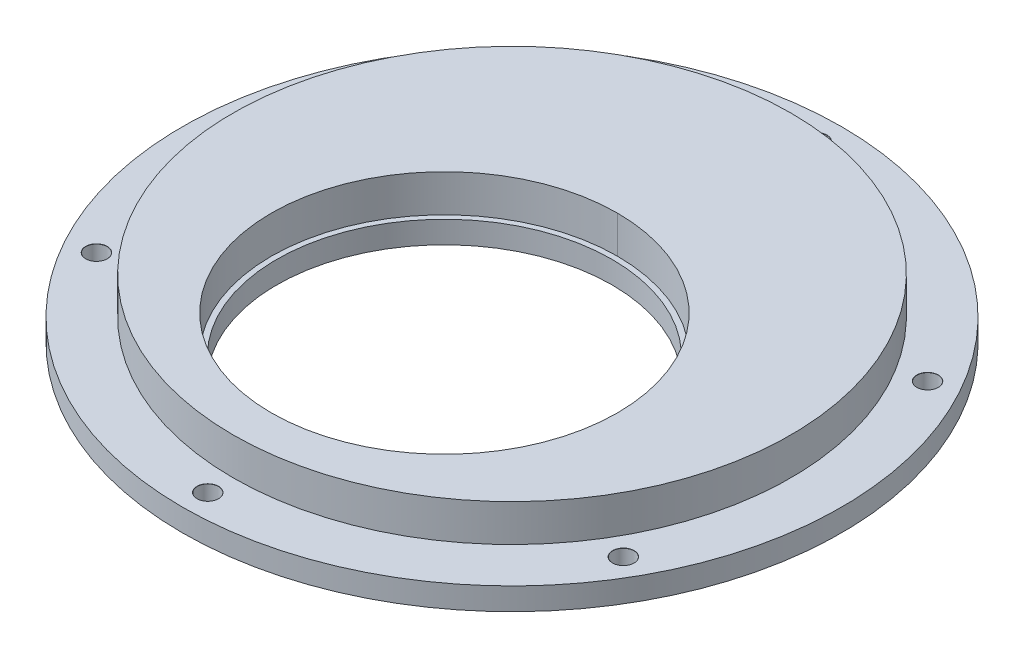
ISO-10303-21;
HEADER;
FILE_DESCRIPTION(('STEP AP214'),'2;1');
FILE_NAME('part.step','',(''),(''),'','','');
FILE_SCHEMA(('AUTOMOTIVE_DESIGN { 1 0 10303 214 1 1 1 1 }'));
ENDSEC;
DATA;
#1=APPLICATION_CONTEXT('core data for automotive mechanical design processes');
#2=APPLICATION_PROTOCOL_DEFINITION('international standard','automotive_design',2000,#1);
#3=PRODUCT_CONTEXT('',#1,'mechanical');
#4=PRODUCT('Part','Part','',(#3));
#5=PRODUCT_RELATED_PRODUCT_CATEGORY('part','',(#4));
#6=PRODUCT_DEFINITION_FORMATION('','',#4);
#7=PRODUCT_DEFINITION_CONTEXT('part definition',#1,'design');
#8=PRODUCT_DEFINITION('design','',#6,#7);
#9=PRODUCT_DEFINITION_SHAPE('','',#8);
#10=(LENGTH_UNIT() NAMED_UNIT(*) SI_UNIT(.MILLI.,.METRE.));
#11=(NAMED_UNIT(*) PLANE_ANGLE_UNIT() SI_UNIT($,.RADIAN.));
#12=(NAMED_UNIT(*) SI_UNIT($,.STERADIAN.) SOLID_ANGLE_UNIT());
#13=UNCERTAINTY_MEASURE_WITH_UNIT(LENGTH_MEASURE(1.E-05),#10,'distance_accuracy_value','');
#14=(GEOMETRIC_REPRESENTATION_CONTEXT(3) GLOBAL_UNCERTAINTY_ASSIGNED_CONTEXT((#13)) GLOBAL_UNIT_ASSIGNED_CONTEXT((#10,
#11,#12)) REPRESENTATION_CONTEXT('',''));
#15=CARTESIAN_POINT('',(0.,0.,0.));
#16=DIRECTION('',(0.,0.,1.));
#17=DIRECTION('',(1.,0.,0.));
#18=AXIS2_PLACEMENT_3D('',#15,#16,#17);
#19=CARTESIAN_POINT('',(0.,4.160000062,12.7));
#20=DIRECTION('',(0.,-1.,0.));
#21=DIRECTION('',(0.,0.,-1.));
#22=AXIS2_PLACEMENT_3D('',#19,#20,#21);
#23=CYLINDRICAL_SURFACE('',#22,32.512);
#24=CARTESIAN_POINT('',(0.,4.160000062,12.7));
#25=DIRECTION('',(0.,-1.,0.));
#26=DIRECTION('',(0.,0.,-1.));
#27=AXIS2_PLACEMENT_3D('',#24,#25,#26);
#28=CIRCLE('',#27,32.512);
#29=CARTESIAN_POINT('',(0.,4.160000062,-19.812));
#30=VERTEX_POINT('',#29);
#31=EDGE_CURVE('E11',#30,#30,#28,.T.);
#32=ORIENTED_EDGE('',*,*,#31,.T.);
#33=EDGE_LOOP('',(#32));
#34=FACE_BOUND('',#33,.T.);
#35=CARTESIAN_POINT('',(0.,0.,12.7));
#36=DIRECTION('',(0.,-1.,0.));
#37=DIRECTION('',(0.,0.,-1.));
#38=AXIS2_PLACEMENT_3D('',#35,#36,#37);
#39=CIRCLE('',#38,32.512);
#40=CARTESIAN_POINT('',(0.,0.,-19.812));
#41=VERTEX_POINT('',#40);
#42=EDGE_CURVE('E54',#41,#41,#39,.T.);
#43=ORIENTED_EDGE('',*,*,#42,.F.);
#44=EDGE_LOOP('',(#43));
#45=FACE_BOUND('',#44,.T.);
#46=ADVANCED_FACE('F51',(#34,#45),#23,.T.);
#47=CARTESIAN_POINT('',(0.,4.160000062,12.7));
#48=DIRECTION('',(0.,-1.,0.));
#49=DIRECTION('',(0.,0.,-1.));
#50=AXIS2_PLACEMENT_3D('',#47,#48,#49);
#51=PLANE('',#50);
#52=CARTESIAN_POINT('',(0.,4.160000062,12.7));
#53=DIRECTION('',(0.,-1.,0.));
#54=DIRECTION('',(0.,0.,-1.));
#55=AXIS2_PLACEMENT_3D('',#52,#53,#54);
#56=CIRCLE('',#55,31.496);
#57=CARTESIAN_POINT('',(0.,4.160000062,-18.796));
#58=VERTEX_POINT('',#57);
#59=EDGE_CURVE('E61',#58,#58,#56,.T.);
#60=ORIENTED_EDGE('',*,*,#59,.T.);
#61=EDGE_LOOP('',(#60));
#62=FACE_BOUND('',#61,.T.);
#63=ORIENTED_EDGE('',*,*,#31,.F.);
#64=EDGE_LOOP('',(#63));
#65=FACE_BOUND('',#64,.T.);
#66=ADVANCED_FACE('F69',(#62,#65),#51,.F.);
#67=CARTESIAN_POINT('',(0.,0.,12.7));
#68=DIRECTION('',(0.,-1.,0.));
#69=DIRECTION('',(0.,0.,-1.));
#70=AXIS2_PLACEMENT_3D('',#67,#68,#69);
#71=PLANE('',#70);
#72=CARTESIAN_POINT('',(0.,0.,12.7));
#73=DIRECTION('',(0.,-1.,0.));
#74=DIRECTION('',(0.,0.,-1.));
#75=AXIS2_PLACEMENT_3D('',#72,#73,#74);
#76=CIRCLE('',#75,31.496);
#77=CARTESIAN_POINT('',(0.,0.,-18.796));
#78=VERTEX_POINT('',#77);
#79=EDGE_CURVE('E63',#78,#78,#76,.T.);
#80=ORIENTED_EDGE('',*,*,#79,.F.);
#81=EDGE_LOOP('',(#80));
#82=FACE_BOUND('',#81,.T.);
#83=ORIENTED_EDGE('',*,*,#42,.T.);
#84=EDGE_LOOP('',(#83));
#85=FACE_BOUND('',#84,.T.);
#86=ADVANCED_FACE('F75',(#82,#85),#71,.T.);
#87=CARTESIAN_POINT('',(0.,4.160000062,12.7));
#88=DIRECTION('',(0.,-1.,0.));
#89=DIRECTION('',(0.,0.,-1.));
#90=AXIS2_PLACEMENT_3D('',#87,#88,#89);
#91=CYLINDRICAL_SURFACE('',#90,31.496);
#92=ORIENTED_EDGE('',*,*,#59,.F.);
#93=EDGE_LOOP('',(#92));
#94=FACE_BOUND('',#93,.T.);
#95=ORIENTED_EDGE('',*,*,#79,.T.);
#96=EDGE_LOOP('',(#95));
#97=FACE_BOUND('',#96,.T.);
#98=ADVANCED_FACE('F72',(#94,#97),#91,.F.);
#99=CLOSED_SHELL('',(#46,#66,#86,#98));
#100=MANIFOLD_SOLID_BREP('B2',#99);
#101=CARTESIAN_POINT('',(-49.4933518262803,4.191,-28.5750000000006));
#102=DIRECTION('',(0.,1.,0.));
#103=DIRECTION('',(0.,0.,1.));
#104=AXIS2_PLACEMENT_3D('',#101,#102,#103);
#105=CYLINDRICAL_SURFACE('',#104,2.);
#106=CARTESIAN_POINT('',(-49.4933518262803,0.,-28.5750000000006));
#107=DIRECTION('',(0.,1.,0.));
#108=DIRECTION('',(0.,0.,1.));
#109=AXIS2_PLACEMENT_3D('',#106,#107,#108);
#110=CIRCLE('',#109,2.);
#111=CARTESIAN_POINT('',(-49.4933518262803,0.,-30.5750000000006));
#112=VERTEX_POINT('',#111);
#113=CARTESIAN_POINT('',(-49.4933518262803,0.,-26.5750000000006));
#114=VERTEX_POINT('',#113);
#115=EDGE_CURVE('E215',#112,#114,#110,.T.);
#116=ORIENTED_EDGE('',*,*,#115,.F.);
#117=DIRECTION('',(0.,1.,0.));
#118=VECTOR('',#117,1.);
#119=CARTESIAN_POINT('',(-49.4933518262803,4.191,-30.5750000000006));
#120=LINE('',#119,#118);
#121=CARTESIAN_POINT('',(-49.4933518262803,4.166,-30.5750000000006));
#122=VERTEX_POINT('',#121);
#123=EDGE_CURVE('E49',#112,#122,#120,.T.);
#124=ORIENTED_EDGE('',*,*,#123,.T.);
#125=CARTESIAN_POINT('',(-49.4933518262803,4.166,-28.5750000000006));
#126=DIRECTION('',(0.,1.,0.));
#127=DIRECTION('',(0.,0.,1.));
#128=AXIS2_PLACEMENT_3D('',#125,#126,#127);
#129=CIRCLE('',#128,2.);
#130=CARTESIAN_POINT('',(-49.4933518262803,4.166,-26.5750000000006));
#131=VERTEX_POINT('',#130);
#132=EDGE_CURVE('E217',#122,#131,#129,.T.);
#133=ORIENTED_EDGE('',*,*,#132,.T.);
#134=DIRECTION('',(0.,-1.,0.));
#135=VECTOR('',#134,1.);
#136=CARTESIAN_POINT('',(-49.4933518262803,4.191,-26.5750000000006));
#137=LINE('',#136,#135);
#138=EDGE_CURVE('E122',#131,#114,#137,.T.);
#139=ORIENTED_EDGE('',*,*,#138,.T.);
#140=EDGE_LOOP('',(#116,#124,#133,#139));
#141=FACE_BOUND('',#140,.T.);
#142=ADVANCED_FACE('F113',(#141),#105,.F.);
#143=CARTESIAN_POINT('',(0.,4.191,-57.15));
#144=DIRECTION('',(0.,1.,0.));
#145=DIRECTION('',(0.,0.,1.));
#146=AXIS2_PLACEMENT_3D('',#143,#144,#145);
#147=CYLINDRICAL_SURFACE('',#146,2.);
#148=CARTESIAN_POINT('',(0.,0.,-57.15));
#149=DIRECTION('',(0.,1.,0.));
#150=DIRECTION('',(0.,0.,1.));
#151=AXIS2_PLACEMENT_3D('',#148,#149,#150);
#152=CIRCLE('',#151,2.);
#153=CARTESIAN_POINT('',(0.,0.,-59.15));
#154=VERTEX_POINT('',#153);
#155=CARTESIAN_POINT('',(0.,0.,-55.15));
#156=VERTEX_POINT('',#155);
#157=EDGE_CURVE('E268',#154,#156,#152,.T.);
#158=ORIENTED_EDGE('',*,*,#157,.F.);
#159=DIRECTION('',(0.,1.,0.));
#160=VECTOR('',#159,1.);
#161=CARTESIAN_POINT('',(0.,4.191,-59.15));
#162=LINE('',#161,#160);
#163=CARTESIAN_POINT('',(0.,4.166,-59.15));
#164=VERTEX_POINT('',#163);
#165=EDGE_CURVE('E208',#154,#164,#162,.T.);
#166=ORIENTED_EDGE('',*,*,#165,.T.);
#167=CARTESIAN_POINT('',(0.,4.166,-57.15));
#168=DIRECTION('',(0.,1.,0.));
#169=DIRECTION('',(0.,0.,1.));
#170=AXIS2_PLACEMENT_3D('',#167,#168,#169);
#171=CIRCLE('',#170,2.);
#172=CARTESIAN_POINT('',(0.,4.166,-55.15));
#173=VERTEX_POINT('',#172);
#174=EDGE_CURVE('E265',#164,#173,#171,.T.);
#175=ORIENTED_EDGE('',*,*,#174,.T.);
#176=DIRECTION('',(0.,-1.,0.));
#177=VECTOR('',#176,1.);
#178=CARTESIAN_POINT('',(0.,4.191,-55.15));
#179=LINE('',#178,#177);
#180=EDGE_CURVE('E204',#173,#156,#179,.T.);
#181=ORIENTED_EDGE('',*,*,#180,.T.);
#182=EDGE_LOOP('',(#158,#166,#175,#181));
#183=FACE_BOUND('',#182,.T.);
#184=ADVANCED_FACE('F275',(#183),#147,.F.);
#185=CARTESIAN_POINT('',(0.,11.176,12.7));
#186=DIRECTION('',(0.,-1.,0.));
#187=DIRECTION('',(0.,0.,-1.));
#188=AXIS2_PLACEMENT_3D('',#185,#186,#187);
#189=CYLINDRICAL_SURFACE('',#188,32.512);
#190=CARTESIAN_POINT('',(0.,11.176,12.7));
#191=DIRECTION('',(0.,-1.,0.));
#192=DIRECTION('',(0.,0.,-1.));
#193=AXIS2_PLACEMENT_3D('',#190,#191,#192);
#194=CIRCLE('',#193,32.512);
#195=CARTESIAN_POINT('',(0.,11.176,45.212));
#196=VERTEX_POINT('',#195);
#197=CARTESIAN_POINT('',(0.,11.176,-19.812));
#198=VERTEX_POINT('',#197);
#199=EDGE_CURVE('E164',#196,#198,#194,.T.);
#200=ORIENTED_EDGE('',*,*,#199,.F.);
#201=DIRECTION('',(0.,-1.,0.));
#202=VECTOR('',#201,1.);
#203=CARTESIAN_POINT('',(0.,11.176,45.212));
#204=LINE('',#203,#202);
#205=CARTESIAN_POINT('',(0.,0.,45.212));
#206=VERTEX_POINT('',#205);
#207=EDGE_CURVE('E182',#196,#206,#204,.T.);
#208=ORIENTED_EDGE('',*,*,#207,.T.);
#209=CARTESIAN_POINT('',(0.,0.,12.7));
#210=DIRECTION('',(0.,-1.,0.));
#211=DIRECTION('',(0.,0.,-1.));
#212=AXIS2_PLACEMENT_3D('',#209,#210,#211);
#213=CIRCLE('',#212,32.512);
#214=CARTESIAN_POINT('',(0.,0.,-19.812));
#215=VERTEX_POINT('',#214);
#216=EDGE_CURVE('E177',#206,#215,#213,.T.);
#217=ORIENTED_EDGE('',*,*,#216,.T.);
#218=DIRECTION('',(0.,1.,0.));
#219=VECTOR('',#218,1.);
#220=CARTESIAN_POINT('',(0.,11.176,-19.812));
#221=LINE('',#220,#219);
#222=EDGE_CURVE('E174',#215,#198,#221,.T.);
#223=ORIENTED_EDGE('',*,*,#222,.T.);
#224=EDGE_LOOP('',(#200,#208,#217,#223));
#225=FACE_BOUND('',#224,.T.);
#226=ADVANCED_FACE('F175',(#225),#189,.F.);
#227=CARTESIAN_POINT('',(0.,4.191,0.));
#228=DIRECTION('',(0.,1.,0.));
#229=DIRECTION('',(0.,0.,1.));
#230=AXIS2_PLACEMENT_3D('',#227,#228,#229);
#231=PLANE('',#230);
#232=CARTESIAN_POINT('',(-49.4933518262803,4.191,-28.5750000000006));
#233=DIRECTION('',(0.,1.,0.));
#234=DIRECTION('',(0.,0.,1.));
#235=AXIS2_PLACEMENT_3D('',#232,#233,#234);
#236=CIRCLE('',#235,2.025);
#237=CARTESIAN_POINT('',(-49.4933518262803,4.191,-26.5500000000006));
#238=VERTEX_POINT('',#237);
#239=EDGE_CURVE('E575',#238,#238,#236,.T.);
#240=ORIENTED_EDGE('',*,*,#239,.F.);
#241=EDGE_LOOP('',(#240));
#242=FACE_BOUND('',#241,.T.);
#243=CARTESIAN_POINT('',(-49.4933518262809,4.191,28.5749999999995));
#244=DIRECTION('',(0.,1.,0.));
#245=DIRECTION('',(0.,0.,1.));
#246=AXIS2_PLACEMENT_3D('',#243,#244,#245);
#247=CIRCLE('',#246,2.025);
#248=CARTESIAN_POINT('',(-49.4933518262809,4.191,30.5999999999995));
#249=VERTEX_POINT('',#248);
#250=EDGE_CURVE('E222',#249,#249,#247,.T.);
#251=ORIENTED_EDGE('',*,*,#250,.F.);
#252=EDGE_LOOP('',(#251));
#253=FACE_BOUND('',#252,.T.);
#254=CARTESIAN_POINT('',(0.,4.191,57.15));
#255=DIRECTION('',(0.,1.,0.));
#256=DIRECTION('',(0.,0.,1.));
#257=AXIS2_PLACEMENT_3D('',#254,#255,#256);
#258=CIRCLE('',#257,2.025);
#259=CARTESIAN_POINT('',(0.,4.191,59.175));
#260=VERTEX_POINT('',#259);
#261=EDGE_CURVE('E236',#260,#260,#258,.T.);
#262=ORIENTED_EDGE('',*,*,#261,.F.);
#263=EDGE_LOOP('',(#262));
#264=FACE_BOUND('',#263,.T.);
#265=CARTESIAN_POINT('',(49.4933518262805,4.191,28.5750000000002));
#266=DIRECTION('',(0.,1.,0.));
#267=DIRECTION('',(0.,0.,1.));
#268=AXIS2_PLACEMENT_3D('',#265,#266,#267);
#269=CIRCLE('',#268,2.025);
#270=CARTESIAN_POINT('',(49.4933518262805,4.191,30.6000000000002));
#271=VERTEX_POINT('',#270);
#272=EDGE_CURVE('E245',#271,#271,#269,.T.);
#273=ORIENTED_EDGE('',*,*,#272,.F.);
#274=EDGE_LOOP('',(#273));
#275=FACE_BOUND('',#274,.T.);
#276=CARTESIAN_POINT('',(49.4933518262807,4.191,-28.5749999999999));
#277=DIRECTION('',(0.,1.,0.));
#278=DIRECTION('',(0.,0.,1.));
#279=AXIS2_PLACEMENT_3D('',#276,#277,#278);
#280=CIRCLE('',#279,2.025);
#281=CARTESIAN_POINT('',(49.4933518262807,4.191,-26.5499999999999));
#282=VERTEX_POINT('',#281);
#283=EDGE_CURVE('E254',#282,#282,#280,.T.);
#284=ORIENTED_EDGE('',*,*,#283,.F.);
#285=EDGE_LOOP('',(#284));
#286=FACE_BOUND('',#285,.T.);
#287=CARTESIAN_POINT('',(0.,4.191,-57.15));
#288=DIRECTION('',(0.,1.,0.));
#289=DIRECTION('',(0.,0.,1.));
#290=AXIS2_PLACEMENT_3D('',#287,#288,#289);
#291=CIRCLE('',#290,2.025);
#292=CARTESIAN_POINT('',(0.,4.191,-55.125));
#293=VERTEX_POINT('',#292);
#294=EDGE_CURVE('E263',#293,#293,#291,.T.);
#295=ORIENTED_EDGE('',*,*,#294,.F.);
#296=EDGE_LOOP('',(#295));
#297=FACE_BOUND('',#296,.T.);
#298=CARTESIAN_POINT('',(0.,4.191,0.));
#299=DIRECTION('',(0.,1.,0.));
#300=DIRECTION('',(0.,0.,1.));
#301=AXIS2_PLACEMENT_3D('',#298,#299,#300);
#302=CIRCLE('',#301,52.3875);
#303=CARTESIAN_POINT('',(0.,4.191,52.3875));
#304=VERTEX_POINT('',#303);
#305=EDGE_CURVE('E183',#304,#304,#302,.T.);
#306=ORIENTED_EDGE('',*,*,#305,.F.);
#307=EDGE_LOOP('',(#306));
#308=FACE_BOUND('',#307,.T.);
#309=CARTESIAN_POINT('',(0.,4.191,0.));
#310=DIRECTION('',(0.,1.,0.));
#311=DIRECTION('',(0.,0.,1.));
#312=AXIS2_PLACEMENT_3D('',#309,#310,#311);
#313=CIRCLE('',#312,61.9125);
#314=CARTESIAN_POINT('',(0.,4.191,61.9125));
#315=VERTEX_POINT('',#314);
#316=EDGE_CURVE('E197',#315,#315,#313,.T.);
#317=ORIENTED_EDGE('',*,*,#316,.T.);
#318=EDGE_LOOP('',(#317));
#319=FACE_BOUND('',#318,.T.);
#320=ADVANCED_FACE('F287',(#242,#253,#264,#275,#286,#297,#308,#319),#231,.T.);
#321=CARTESIAN_POINT('',(0.,0.,0.));
#322=DIRECTION('',(0.,1.,0.));
#323=DIRECTION('',(0.,0.,1.));
#324=AXIS2_PLACEMENT_3D('',#321,#322,#323);
#325=PLANE('',#324);
#326=EDGE_CURVE('E219',#114,#112,#110,.T.);
#327=ORIENTED_EDGE('',*,*,#326,.T.);
#328=ORIENTED_EDGE('',*,*,#115,.T.);
#329=EDGE_LOOP('',(#327,#328));
#330=FACE_BOUND('',#329,.T.);
#331=CARTESIAN_POINT('',(-49.4933518262809,0.,28.5749999999995));
#332=DIRECTION('',(0.,1.,0.));
#333=DIRECTION('',(0.,0.,1.));
#334=AXIS2_PLACEMENT_3D('',#331,#332,#333);
#335=CIRCLE('',#334,2.);
#336=CARTESIAN_POINT('',(-49.4933518262809,0.,30.5749999999995));
#337=VERTEX_POINT('',#336);
#338=EDGE_CURVE('E233',#337,#337,#335,.T.);
#339=ORIENTED_EDGE('',*,*,#338,.T.);
#340=EDGE_LOOP('',(#339));
#341=FACE_BOUND('',#340,.T.);
#342=CARTESIAN_POINT('',(0.,0.,57.15));
#343=DIRECTION('',(0.,1.,0.));
#344=DIRECTION('',(0.,0.,1.));
#345=AXIS2_PLACEMENT_3D('',#342,#343,#344);
#346=CIRCLE('',#345,2.);
#347=CARTESIAN_POINT('',(0.,0.,59.15));
#348=VERTEX_POINT('',#347);
#349=EDGE_CURVE('E242',#348,#348,#346,.T.);
#350=ORIENTED_EDGE('',*,*,#349,.T.);
#351=EDGE_LOOP('',(#350));
#352=FACE_BOUND('',#351,.T.);
#353=CARTESIAN_POINT('',(49.4933518262805,0.,28.5750000000002));
#354=DIRECTION('',(0.,1.,0.));
#355=DIRECTION('',(0.,0.,1.));
#356=AXIS2_PLACEMENT_3D('',#353,#354,#355);
#357=CIRCLE('',#356,2.);
#358=CARTESIAN_POINT('',(49.4933518262805,0.,30.5750000000002));
#359=VERTEX_POINT('',#358);
#360=EDGE_CURVE('E251',#359,#359,#357,.T.);
#361=ORIENTED_EDGE('',*,*,#360,.T.);
#362=EDGE_LOOP('',(#361));
#363=FACE_BOUND('',#362,.T.);
#364=CARTESIAN_POINT('',(49.4933518262807,0.,-28.5749999999999));
#365=DIRECTION('',(0.,1.,0.));
#366=DIRECTION('',(0.,0.,1.));
#367=AXIS2_PLACEMENT_3D('',#364,#365,#366);
#368=CIRCLE('',#367,2.);
#369=CARTESIAN_POINT('',(49.4933518262807,0.,-26.5749999999999));
#370=VERTEX_POINT('',#369);
#371=EDGE_CURVE('E260',#370,#370,#368,.T.);
#372=ORIENTED_EDGE('',*,*,#371,.T.);
#373=EDGE_LOOP('',(#372));
#374=FACE_BOUND('',#373,.T.);
#375=EDGE_CURVE('E192',#156,#154,#152,.T.);
#376=ORIENTED_EDGE('',*,*,#375,.T.);
#377=ORIENTED_EDGE('',*,*,#157,.T.);
#378=EDGE_LOOP('',(#376,#377));
#379=FACE_BOUND('',#378,.T.);
#380=EDGE_CURVE('E171',#215,#206,#213,.T.);
#381=ORIENTED_EDGE('',*,*,#380,.F.);
#382=ORIENTED_EDGE('',*,*,#216,.F.);
#383=EDGE_LOOP('',(#381,#382));
#384=FACE_BOUND('',#383,.T.);
#385=CARTESIAN_POINT('',(0.,0.,0.));
#386=DIRECTION('',(0.,1.,0.));
#387=DIRECTION('',(0.,0.,1.));
#388=AXIS2_PLACEMENT_3D('',#385,#386,#387);
#389=CIRCLE('',#388,61.9125);
#390=CARTESIAN_POINT('',(0.,0.,61.9125));
#391=VERTEX_POINT('',#390);
#392=EDGE_CURVE('E188',#391,#391,#389,.T.);
#393=ORIENTED_EDGE('',*,*,#392,.F.);
#394=EDGE_LOOP('',(#393));
#395=FACE_BOUND('',#394,.T.);
#396=ADVANCED_FACE('F290',(#330,#341,#352,#363,#374,#379,#384,#395),#325,.F.);
#397=CARTESIAN_POINT('',(0.,4.191,0.));
#398=DIRECTION('',(0.,-1.,0.));
#399=DIRECTION('',(0.,0.,-1.));
#400=AXIS2_PLACEMENT_3D('',#397,#398,#399);
#401=CYLINDRICAL_SURFACE('',#400,61.9125);
#402=ORIENTED_EDGE('',*,*,#316,.F.);
#403=EDGE_LOOP('',(#402));
#404=FACE_BOUND('',#403,.T.);
#405=ORIENTED_EDGE('',*,*,#392,.T.);
#406=EDGE_LOOP('',(#405));
#407=FACE_BOUND('',#406,.T.);
#408=ADVANCED_FACE('F115',(#404,#407),#401,.T.);
#409=CARTESIAN_POINT('',(0.,11.176,0.));
#410=DIRECTION('',(0.,1.,0.));
#411=DIRECTION('',(0.,0.,1.));
#412=AXIS2_PLACEMENT_3D('',#409,#410,#411);
#413=PLANE('',#412);
#414=EDGE_CURVE('E169',#198,#196,#194,.T.);
#415=ORIENTED_EDGE('',*,*,#414,.T.);
#416=ORIENTED_EDGE('',*,*,#199,.T.);
#417=EDGE_LOOP('',(#415,#416));
#418=FACE_BOUND('',#417,.T.);
#419=CARTESIAN_POINT('',(0.,11.176,0.));
#420=DIRECTION('',(0.,1.,0.));
#421=DIRECTION('',(0.,0.,1.));
#422=AXIS2_PLACEMENT_3D('',#419,#420,#421);
#423=CIRCLE('',#422,52.3875);
#424=CARTESIAN_POINT('',(0.,11.176,52.3875));
#425=VERTEX_POINT('',#424);
#426=EDGE_CURVE('E186',#425,#425,#423,.T.);
#427=ORIENTED_EDGE('',*,*,#426,.T.);
#428=EDGE_LOOP('',(#427));
#429=FACE_BOUND('',#428,.T.);
#430=ADVANCED_FACE('F166',(#418,#429),#413,.T.);
#431=CARTESIAN_POINT('',(0.,11.176,0.));
#432=DIRECTION('',(0.,-1.,0.));
#433=DIRECTION('',(0.,0.,-1.));
#434=AXIS2_PLACEMENT_3D('',#431,#432,#433);
#435=CYLINDRICAL_SURFACE('',#434,52.3875);
#436=ORIENTED_EDGE('',*,*,#426,.F.);
#437=EDGE_LOOP('',(#436));
#438=FACE_BOUND('',#437,.T.);
#439=ORIENTED_EDGE('',*,*,#305,.T.);
#440=EDGE_LOOP('',(#439));
#441=FACE_BOUND('',#440,.T.);
#442=ADVANCED_FACE('F357',(#438,#441),#435,.T.);
#443=ORIENTED_EDGE('',*,*,#207,.F.);
#444=ORIENTED_EDGE('',*,*,#414,.F.);
#445=ORIENTED_EDGE('',*,*,#222,.F.);
#446=ORIENTED_EDGE('',*,*,#380,.T.);
#447=EDGE_LOOP('',(#443,#444,#445,#446));
#448=FACE_BOUND('',#447,.T.);
#449=ADVANCED_FACE('F185',(#448),#189,.F.);
#450=ORIENTED_EDGE('',*,*,#165,.F.);
#451=ORIENTED_EDGE('',*,*,#375,.F.);
#452=ORIENTED_EDGE('',*,*,#180,.F.);
#453=EDGE_CURVE('E266',#173,#164,#171,.T.);
#454=ORIENTED_EDGE('',*,*,#453,.T.);
#455=EDGE_LOOP('',(#450,#451,#452,#454));
#456=FACE_BOUND('',#455,.T.);
#457=ADVANCED_FACE('F278',(#456),#147,.F.);
#458=CARTESIAN_POINT('',(0.,4.191,-57.15));
#459=DIRECTION('',(0.,1.,0.));
#460=DIRECTION('',(0.,0.,1.));
#461=AXIS2_PLACEMENT_3D('',#458,#459,#460);
#462=CONICAL_SURFACE('',#461,2.025,0.785398163397457);
#463=ORIENTED_EDGE('',*,*,#453,.F.);
#464=ORIENTED_EDGE('',*,*,#174,.F.);
#465=EDGE_LOOP('',(#463,#464));
#466=FACE_BOUND('',#465,.T.);
#467=ORIENTED_EDGE('',*,*,#294,.T.);
#468=EDGE_LOOP('',(#467));
#469=FACE_BOUND('',#468,.T.);
#470=ADVANCED_FACE('F280',(#466,#469),#462,.F.);
#471=CARTESIAN_POINT('',(49.4933518262807,4.191,-28.5749999999999));
#472=DIRECTION('',(0.,1.,0.));
#473=DIRECTION('',(0.,0.,1.));
#474=AXIS2_PLACEMENT_3D('',#471,#472,#473);
#475=CYLINDRICAL_SURFACE('',#474,2.);
#476=ORIENTED_EDGE('',*,*,#371,.F.);
#477=EDGE_LOOP('',(#476));
#478=FACE_BOUND('',#477,.T.);
#479=CARTESIAN_POINT('',(49.4933518262807,4.166,-28.5749999999999));
#480=DIRECTION('',(0.,1.,0.));
#481=DIRECTION('',(0.,0.,1.));
#482=AXIS2_PLACEMENT_3D('',#479,#480,#481);
#483=CIRCLE('',#482,2.);
#484=CARTESIAN_POINT('',(49.4933518262807,4.166,-26.5749999999999));
#485=VERTEX_POINT('',#484);
#486=EDGE_CURVE('E257',#485,#485,#483,.T.);
#487=ORIENTED_EDGE('',*,*,#486,.T.);
#488=EDGE_LOOP('',(#487));
#489=FACE_BOUND('',#488,.T.);
#490=ADVANCED_FACE('F283',(#478,#489),#475,.F.);
#491=CARTESIAN_POINT('',(49.4933518262807,4.191,-28.5749999999999));
#492=DIRECTION('',(0.,1.,0.));
#493=DIRECTION('',(0.,0.,1.));
#494=AXIS2_PLACEMENT_3D('',#491,#492,#493);
#495=CONICAL_SURFACE('',#494,2.025,0.785398163397396);
#496=ORIENTED_EDGE('',*,*,#486,.F.);
#497=EDGE_LOOP('',(#496));
#498=FACE_BOUND('',#497,.T.);
#499=ORIENTED_EDGE('',*,*,#283,.T.);
#500=EDGE_LOOP('',(#499));
#501=FACE_BOUND('',#500,.T.);
#502=ADVANCED_FACE('F346',(#498,#501),#495,.F.);
#503=CARTESIAN_POINT('',(49.4933518262805,4.191,28.5750000000002));
#504=DIRECTION('',(0.,1.,0.));
#505=DIRECTION('',(0.,0.,1.));
#506=AXIS2_PLACEMENT_3D('',#503,#504,#505);
#507=CYLINDRICAL_SURFACE('',#506,2.);
#508=ORIENTED_EDGE('',*,*,#360,.F.);
#509=EDGE_LOOP('',(#508));
#510=FACE_BOUND('',#509,.T.);
#511=CARTESIAN_POINT('',(49.4933518262805,4.166,28.5750000000002));
#512=DIRECTION('',(0.,1.,0.));
#513=DIRECTION('',(0.,0.,1.));
#514=AXIS2_PLACEMENT_3D('',#511,#512,#513);
#515=CIRCLE('',#514,2.);
#516=CARTESIAN_POINT('',(49.4933518262805,4.166,30.5750000000002));
#517=VERTEX_POINT('',#516);
#518=EDGE_CURVE('E248',#517,#517,#515,.T.);
#519=ORIENTED_EDGE('',*,*,#518,.T.);
#520=EDGE_LOOP('',(#519));
#521=FACE_BOUND('',#520,.T.);
#522=ADVANCED_FACE('F342',(#510,#521),#507,.F.);
#523=CARTESIAN_POINT('',(49.4933518262805,4.191,28.5750000000002));
#524=DIRECTION('',(0.,1.,0.));
#525=DIRECTION('',(0.,0.,1.));
#526=AXIS2_PLACEMENT_3D('',#523,#524,#525);
#527=CONICAL_SURFACE('',#526,2.025,0.785398163397396);
#528=ORIENTED_EDGE('',*,*,#518,.F.);
#529=EDGE_LOOP('',(#528));
#530=FACE_BOUND('',#529,.T.);
#531=ORIENTED_EDGE('',*,*,#272,.T.);
#532=EDGE_LOOP('',(#531));
#533=FACE_BOUND('',#532,.T.);
#534=ADVANCED_FACE('F338',(#530,#533),#527,.F.);
#535=CARTESIAN_POINT('',(0.,4.191,57.15));
#536=DIRECTION('',(0.,1.,0.));
#537=DIRECTION('',(0.,0.,1.));
#538=AXIS2_PLACEMENT_3D('',#535,#536,#537);
#539=CYLINDRICAL_SURFACE('',#538,2.);
#540=ORIENTED_EDGE('',*,*,#349,.F.);
#541=EDGE_LOOP('',(#540));
#542=FACE_BOUND('',#541,.T.);
#543=CARTESIAN_POINT('',(0.,4.166,57.15));
#544=DIRECTION('',(0.,1.,0.));
#545=DIRECTION('',(0.,0.,1.));
#546=AXIS2_PLACEMENT_3D('',#543,#544,#545);
#547=CIRCLE('',#546,2.);
#548=CARTESIAN_POINT('',(0.,4.166,59.15));
#549=VERTEX_POINT('',#548);
#550=EDGE_CURVE('E239',#549,#549,#547,.T.);
#551=ORIENTED_EDGE('',*,*,#550,.T.);
#552=EDGE_LOOP('',(#551));
#553=FACE_BOUND('',#552,.T.);
#554=ADVANCED_FACE('F334',(#542,#553),#539,.F.);
#555=CARTESIAN_POINT('',(0.,4.191,57.15));
#556=DIRECTION('',(0.,1.,0.));
#557=DIRECTION('',(0.,0.,1.));
#558=AXIS2_PLACEMENT_3D('',#555,#556,#557);
#559=CONICAL_SURFACE('',#558,2.025,0.785398163397457);
#560=ORIENTED_EDGE('',*,*,#550,.F.);
#561=EDGE_LOOP('',(#560));
#562=FACE_BOUND('',#561,.T.);
#563=ORIENTED_EDGE('',*,*,#261,.T.);
#564=EDGE_LOOP('',(#563));
#565=FACE_BOUND('',#564,.T.);
#566=ADVANCED_FACE('F326',(#562,#565),#559,.F.);
#567=CARTESIAN_POINT('',(-49.4933518262809,4.191,28.5749999999995));
#568=DIRECTION('',(0.,1.,0.));
#569=DIRECTION('',(0.,0.,1.));
#570=AXIS2_PLACEMENT_3D('',#567,#568,#569);
#571=CYLINDRICAL_SURFACE('',#570,2.);
#572=ORIENTED_EDGE('',*,*,#338,.F.);
#573=EDGE_LOOP('',(#572));
#574=FACE_BOUND('',#573,.T.);
#575=CARTESIAN_POINT('',(-49.4933518262809,4.166,28.5749999999995));
#576=DIRECTION('',(0.,1.,0.));
#577=DIRECTION('',(0.,0.,1.));
#578=AXIS2_PLACEMENT_3D('',#575,#576,#577);
#579=CIRCLE('',#578,2.);
#580=CARTESIAN_POINT('',(-49.4933518262809,4.166,30.5749999999995));
#581=VERTEX_POINT('',#580);
#582=EDGE_CURVE('E225',#581,#581,#579,.T.);
#583=ORIENTED_EDGE('',*,*,#582,.T.);
#584=EDGE_LOOP('',(#583));
#585=FACE_BOUND('',#584,.T.);
#586=ADVANCED_FACE('F321',(#574,#585),#571,.F.);
#587=CARTESIAN_POINT('',(-49.4933518262809,4.191,28.5749999999995));
#588=DIRECTION('',(0.,1.,0.));
#589=DIRECTION('',(0.,0.,1.));
#590=AXIS2_PLACEMENT_3D('',#587,#588,#589);
#591=CONICAL_SURFACE('',#590,2.025,0.785398163397396);
#592=ORIENTED_EDGE('',*,*,#582,.F.);
#593=EDGE_LOOP('',(#592));
#594=FACE_BOUND('',#593,.T.);
#595=ORIENTED_EDGE('',*,*,#250,.T.);
#596=EDGE_LOOP('',(#595));
#597=FACE_BOUND('',#596,.T.);
#598=ADVANCED_FACE('F315',(#594,#597),#591,.F.);
#599=ORIENTED_EDGE('',*,*,#123,.F.);
#600=ORIENTED_EDGE('',*,*,#326,.F.);
#601=ORIENTED_EDGE('',*,*,#138,.F.);
#602=EDGE_CURVE('E227',#131,#122,#129,.T.);
#603=ORIENTED_EDGE('',*,*,#602,.T.);
#604=EDGE_LOOP('',(#599,#600,#601,#603));
#605=FACE_BOUND('',#604,.T.);
#606=ADVANCED_FACE('F220',(#605),#105,.F.);
#607=CARTESIAN_POINT('',(-49.4933518262803,4.191,-28.5750000000006));
#608=DIRECTION('',(0.,1.,0.));
#609=DIRECTION('',(0.,0.,1.));
#610=AXIS2_PLACEMENT_3D('',#607,#608,#609);
#611=CONICAL_SURFACE('',#610,2.025,0.785398163397396);
#612=ORIENTED_EDGE('',*,*,#602,.F.);
#613=ORIENTED_EDGE('',*,*,#132,.F.);
#614=EDGE_LOOP('',(#612,#613));
#615=FACE_BOUND('',#614,.T.);
#616=ORIENTED_EDGE('',*,*,#239,.T.);
#617=EDGE_LOOP('',(#616));
#618=FACE_BOUND('',#617,.T.);
#619=ADVANCED_FACE('F314',(#615,#618),#611,.F.);
#620=CLOSED_SHELL('',(#142,#184,#226,#320,#396,#408,#430,#442,#449,#457,#470,#490,#502,#522,
#534,#554,#566,#586,#598,#606,#619));
#621=MANIFOLD_SOLID_BREP('B6',#620);
#622=ADVANCED_BREP_SHAPE_REPRESENTATION('',(#18,#100,#621),#14);
#623=SHAPE_DEFINITION_REPRESENTATION(#9,#622);
ENDSEC;
END-ISO-10303-21;
